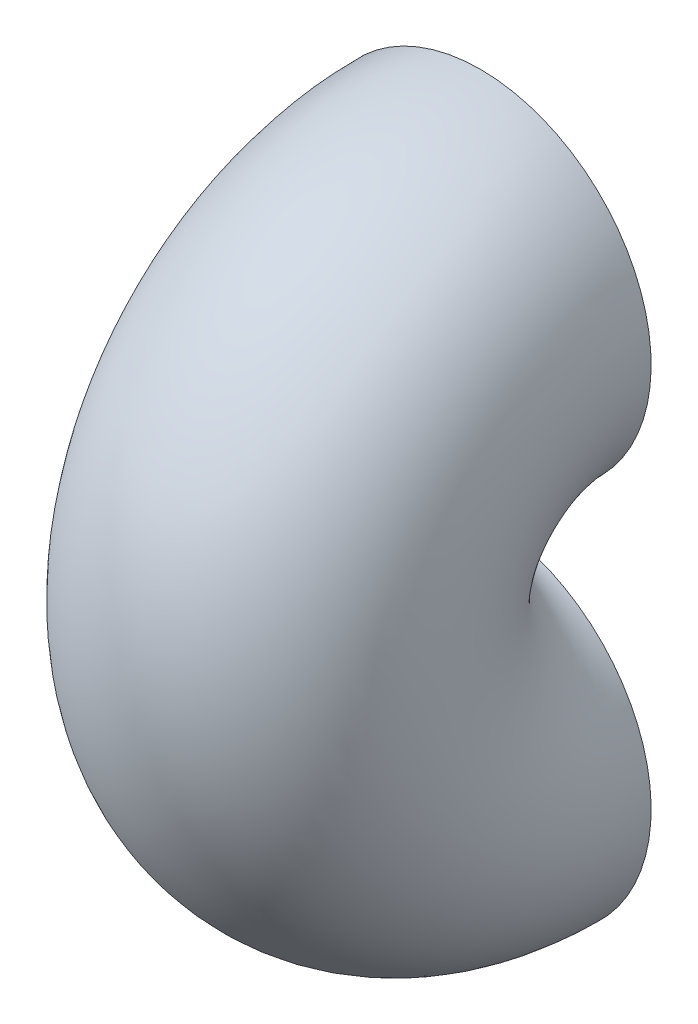
ISO-10303-21;
HEADER;
FILE_DESCRIPTION(('STEP AP214'),'2;1');
FILE_NAME('part.step','',(''),(''),'','','');
FILE_SCHEMA(('AUTOMOTIVE_DESIGN { 1 0 10303 214 1 1 1 1 }'));
ENDSEC;
DATA;
#1=APPLICATION_CONTEXT('core data for automotive mechanical design processes');
#2=APPLICATION_PROTOCOL_DEFINITION('international standard','automotive_design',2000,#1);
#3=PRODUCT_CONTEXT('',#1,'mechanical');
#4=PRODUCT('Part','Part','',(#3));
#5=PRODUCT_RELATED_PRODUCT_CATEGORY('part','',(#4));
#6=PRODUCT_DEFINITION_FORMATION('','',#4);
#7=PRODUCT_DEFINITION_CONTEXT('part definition',#1,'design');
#8=PRODUCT_DEFINITION('design','',#6,#7);
#9=PRODUCT_DEFINITION_SHAPE('','',#8);
#10=(LENGTH_UNIT() NAMED_UNIT(*) SI_UNIT(.MILLI.,.METRE.));
#11=(NAMED_UNIT(*) PLANE_ANGLE_UNIT() SI_UNIT($,.RADIAN.));
#12=(NAMED_UNIT(*) SI_UNIT($,.STERADIAN.) SOLID_ANGLE_UNIT());
#13=UNCERTAINTY_MEASURE_WITH_UNIT(LENGTH_MEASURE(1.E-05),#10,'distance_accuracy_value','');
#14=(GEOMETRIC_REPRESENTATION_CONTEXT(3) GLOBAL_UNCERTAINTY_ASSIGNED_CONTEXT((#13)) GLOBAL_UNIT_ASSIGNED_CONTEXT((#10,
#11,#12)) REPRESENTATION_CONTEXT('',''));
#15=CARTESIAN_POINT('',(0.,0.,0.));
#16=DIRECTION('',(0.,0.,1.));
#17=DIRECTION('',(1.,0.,0.));
#18=AXIS2_PLACEMENT_3D('',#15,#16,#17);
#19=CARTESIAN_POINT('',(0.,-40.,0.));
#20=DIRECTION('',(-1.,0.,0.));
#21=DIRECTION('',(0.,0.,1.));
#22=AXIS2_PLACEMENT_3D('',#19,#20,#21);
#23=TOROIDAL_SURFACE('',#22,40.,32.5);
#24=CARTESIAN_POINT('',(0.,-80.,-2.79318507107451E-13));
#25=DIRECTION('',(0.,0.,-1.));
#26=DIRECTION('',(1.,0.,0.));
#27=AXIS2_PLACEMENT_3D('',#24,#25,#26);
#28=CIRCLE('',#27,32.5);
#29=CARTESIAN_POINT('',(0.,-112.5,-5.06264794132254E-13));
#30=VERTEX_POINT('',#29);
#31=EDGE_CURVE('E38',#30,#30,#28,.T.);
#32=CARTESIAN_POINT('',(0.,0.,0.));
#33=DIRECTION('',(0.,0.,1.));
#34=DIRECTION('',(1.,0.,0.));
#35=AXIS2_PLACEMENT_3D('',#32,#33,#34);
#36=CIRCLE('',#35,32.5);
#37=CARTESIAN_POINT('',(0.,32.5,0.));
#38=VERTEX_POINT('',#37);
#39=EDGE_CURVE('E46',#38,#38,#36,.T.);
#40=CARTESIAN_POINT('',(0.,-40.,0.));
#41=DIRECTION('',(-1.,0.,0.));
#42=DIRECTION('',(0.,0.,1.));
#43=AXIS2_PLACEMENT_3D('',#40,#41,#42);
#44=CIRCLE('',#43,72.5);
#45=EDGE_CURVE('',#30,#38,#44,.T.);
#46=ORIENTED_EDGE('',*,*,#31,.T.);
#47=ORIENTED_EDGE('',*,*,#39,.F.);
#48=ORIENTED_EDGE('',*,*,#45,.T.);
#49=ORIENTED_EDGE('',*,*,#45,.F.);
#50=EDGE_LOOP('',(#46,#48,#47,#49));
#51=FACE_BOUND('',#50,.T.);
#52=ADVANCED_FACE('F31',(#51),#23,.F.);
#53=CARTESIAN_POINT('',(0.,-40.,0.));
#54=DIRECTION('',(-1.,0.,0.));
#55=DIRECTION('',(0.,0.,1.));
#56=AXIS2_PLACEMENT_3D('',#53,#54,#55);
#57=TOROIDAL_SURFACE('',#56,40.,35.5);
#58=CARTESIAN_POINT('',(0.,-80.,-2.79318507107451E-13));
#59=DIRECTION('',(0.,0.,-1.));
#60=DIRECTION('',(1.,0.,0.));
#61=AXIS2_PLACEMENT_3D('',#58,#59,#60);
#62=CIRCLE('',#61,35.5);
#63=CARTESIAN_POINT('',(0.,-115.5,-5.27213682165313E-13));
#64=VERTEX_POINT('',#63);
#65=EDGE_CURVE('E10',#64,#64,#62,.T.);
#66=CARTESIAN_POINT('',(0.,0.,0.));
#67=DIRECTION('',(0.,0.,1.));
#68=DIRECTION('',(1.,0.,0.));
#69=AXIS2_PLACEMENT_3D('',#66,#67,#68);
#70=CIRCLE('',#69,35.5);
#71=CARTESIAN_POINT('',(0.,35.5,0.));
#72=VERTEX_POINT('',#71);
#73=EDGE_CURVE('E42',#72,#72,#70,.T.);
#74=CARTESIAN_POINT('',(0.,-40.,0.));
#75=DIRECTION('',(-1.,0.,0.));
#76=DIRECTION('',(0.,0.,1.));
#77=AXIS2_PLACEMENT_3D('',#74,#75,#76);
#78=CIRCLE('',#77,75.5);
#79=EDGE_CURVE('',#64,#72,#78,.T.);
#80=ORIENTED_EDGE('',*,*,#65,.F.);
#81=ORIENTED_EDGE('',*,*,#73,.T.);
#82=ORIENTED_EDGE('',*,*,#79,.T.);
#83=ORIENTED_EDGE('',*,*,#79,.F.);
#84=EDGE_LOOP('',(#80,#82,#81,#83));
#85=FACE_BOUND('',#84,.T.);
#86=ADVANCED_FACE('F33',(#85),#57,.T.);
#87=CARTESIAN_POINT('',(0.,-80.,-2.79318507107451E-13));
#88=DIRECTION('',(0.,0.,-1.));
#89=DIRECTION('',(1.,0.,0.));
#90=AXIS2_PLACEMENT_3D('',#87,#88,#89);
#91=PLANE('',#90);
#92=ORIENTED_EDGE('',*,*,#31,.F.);
#93=EDGE_LOOP('',(#92));
#94=FACE_BOUND('',#93,.T.);
#95=ORIENTED_EDGE('',*,*,#65,.T.);
#96=EDGE_LOOP('',(#95));
#97=FACE_BOUND('',#96,.T.);
#98=ADVANCED_FACE('F59',(#94,#97),#91,.T.);
#99=CARTESIAN_POINT('',(0.,0.,0.));
#100=DIRECTION('',(0.,0.,1.));
#101=DIRECTION('',(1.,0.,0.));
#102=AXIS2_PLACEMENT_3D('',#99,#100,#101);
#103=PLANE('',#102);
#104=ORIENTED_EDGE('',*,*,#39,.T.);
#105=EDGE_LOOP('',(#104));
#106=FACE_BOUND('',#105,.T.);
#107=ORIENTED_EDGE('',*,*,#73,.F.);
#108=EDGE_LOOP('',(#107));
#109=FACE_BOUND('',#108,.T.);
#110=ADVANCED_FACE('F52',(#106,#109),#103,.F.);
#111=CLOSED_SHELL('',(#52,#86,#98,#110));
#112=MANIFOLD_SOLID_BREP('B2',#111);
#113=ADVANCED_BREP_SHAPE_REPRESENTATION('',(#18,#112),#14);
#114=SHAPE_DEFINITION_REPRESENTATION(#9,#113);
ENDSEC;
END-ISO-10303-21;
